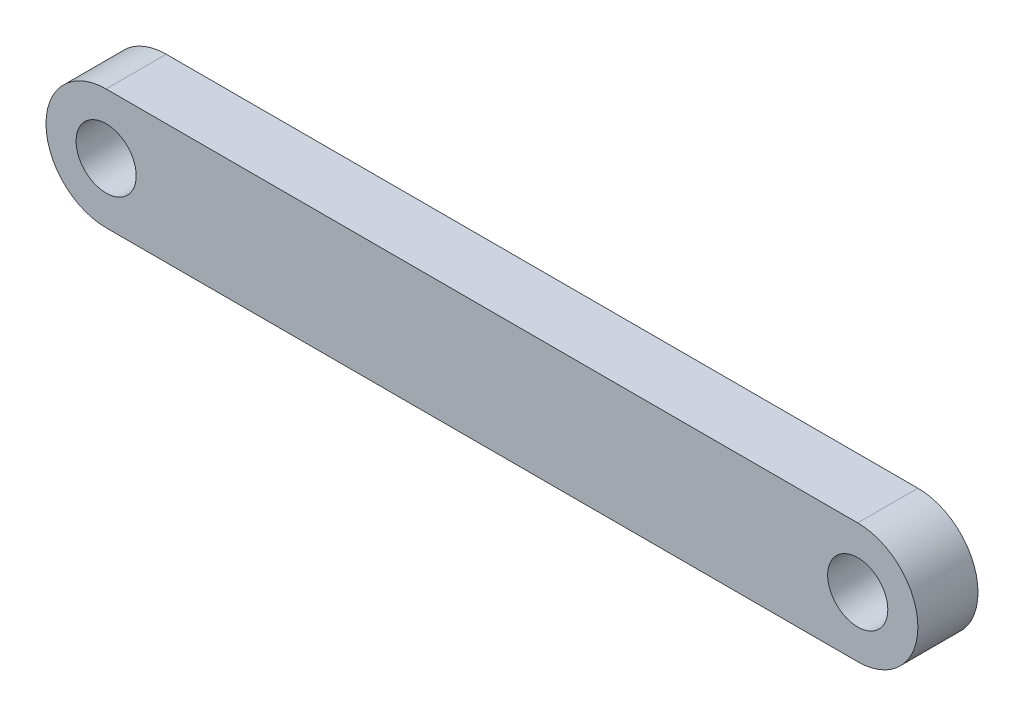
ISO-10303-21;
HEADER;
FILE_DESCRIPTION(('STEP AP214'),'2;1');
FILE_NAME('part.step','',(''),(''),'','','');
FILE_SCHEMA(('AUTOMOTIVE_DESIGN { 1 0 10303 214 1 1 1 1 }'));
ENDSEC;
DATA;
#1=APPLICATION_CONTEXT('core data for automotive mechanical design processes');
#2=APPLICATION_PROTOCOL_DEFINITION('international standard','automotive_design',2000,#1);
#3=PRODUCT_CONTEXT('',#1,'mechanical');
#4=PRODUCT('Part','Part','',(#3));
#5=PRODUCT_RELATED_PRODUCT_CATEGORY('part','',(#4));
#6=PRODUCT_DEFINITION_FORMATION('','',#4);
#7=PRODUCT_DEFINITION_CONTEXT('part definition',#1,'design');
#8=PRODUCT_DEFINITION('design','',#6,#7);
#9=PRODUCT_DEFINITION_SHAPE('','',#8);
#10=(LENGTH_UNIT() NAMED_UNIT(*) SI_UNIT(.MILLI.,.METRE.));
#11=(NAMED_UNIT(*) PLANE_ANGLE_UNIT() SI_UNIT($,.RADIAN.));
#12=(NAMED_UNIT(*) SI_UNIT($,.STERADIAN.) SOLID_ANGLE_UNIT());
#13=UNCERTAINTY_MEASURE_WITH_UNIT(LENGTH_MEASURE(1.E-05),#10,'distance_accuracy_value','');
#14=(GEOMETRIC_REPRESENTATION_CONTEXT(3) GLOBAL_UNCERTAINTY_ASSIGNED_CONTEXT((#13)) GLOBAL_UNIT_ASSIGNED_CONTEXT((#10,
#11,#12)) REPRESENTATION_CONTEXT('',''));
#15=CARTESIAN_POINT('',(0.,0.,0.));
#16=DIRECTION('',(0.,0.,1.));
#17=DIRECTION('',(1.,0.,0.));
#18=AXIS2_PLACEMENT_3D('',#15,#16,#17);
#19=CARTESIAN_POINT('',(-62.5,0.,5.));
#20=DIRECTION('',(0.,0.,1.));
#21=DIRECTION('',(1.,0.,0.));
#22=AXIS2_PLACEMENT_3D('',#19,#20,#21);
#23=PLANE('',#22);
#24=CARTESIAN_POINT('',(-62.5,0.,5.));
#25=DIRECTION('',(0.,0.,1.));
#26=DIRECTION('',(1.,0.,0.));
#27=AXIS2_PLACEMENT_3D('',#24,#25,#26);
#28=CIRCLE('',#27,5.);
#29=CARTESIAN_POINT('',(-57.5,0.,5.));
#30=VERTEX_POINT('',#29);
#31=EDGE_CURVE('E100',#30,#30,#28,.T.);
#32=ORIENTED_EDGE('',*,*,#31,.F.);
#33=EDGE_LOOP('',(#32));
#34=FACE_BOUND('',#33,.T.);
#35=CARTESIAN_POINT('',(-62.5,0.,5.));
#36=DIRECTION('',(0.,0.,1.));
#37=DIRECTION('',(1.,0.,0.));
#38=AXIS2_PLACEMENT_3D('',#35,#36,#37);
#39=CIRCLE('',#38,10.);
#40=CARTESIAN_POINT('',(-62.5,10.,5.));
#41=VERTEX_POINT('',#40);
#42=CARTESIAN_POINT('',(-62.5,-10.,5.));
#43=VERTEX_POINT('',#42);
#44=EDGE_CURVE('E85',#41,#43,#39,.T.);
#45=ORIENTED_EDGE('',*,*,#44,.T.);
#46=DIRECTION('',(1.,0.,0.));
#47=VECTOR('',#46,1.);
#48=CARTESIAN_POINT('',(-62.5,-10.,5.));
#49=LINE('',#48,#47);
#50=CARTESIAN_POINT('',(62.5,-10.,5.));
#51=VERTEX_POINT('',#50);
#52=EDGE_CURVE('E80',#43,#51,#49,.T.);
#53=ORIENTED_EDGE('',*,*,#52,.T.);
#54=CARTESIAN_POINT('',(62.5,0.,5.));
#55=DIRECTION('',(0.,0.,1.));
#56=DIRECTION('',(1.,0.,0.));
#57=AXIS2_PLACEMENT_3D('',#54,#55,#56);
#58=CIRCLE('',#57,10.);
#59=CARTESIAN_POINT('',(62.5,10.,5.));
#60=VERTEX_POINT('',#59);
#61=EDGE_CURVE('E83',#51,#60,#58,.T.);
#62=ORIENTED_EDGE('',*,*,#61,.T.);
#63=DIRECTION('',(-1.,0.,0.));
#64=VECTOR('',#63,1.);
#65=CARTESIAN_POINT('',(-62.5,10.,5.));
#66=LINE('',#65,#64);
#67=EDGE_CURVE('E50',#60,#41,#66,.T.);
#68=ORIENTED_EDGE('',*,*,#67,.T.);
#69=EDGE_LOOP('',(#45,#53,#62,#68));
#70=FACE_BOUND('',#69,.T.);
#71=CARTESIAN_POINT('',(62.5,0.,5.));
#72=DIRECTION('',(0.,0.,1.));
#73=DIRECTION('',(1.,0.,0.));
#74=AXIS2_PLACEMENT_3D('',#71,#72,#73);
#75=CIRCLE('',#74,5.);
#76=CARTESIAN_POINT('',(67.5,0.,5.));
#77=VERTEX_POINT('',#76);
#78=EDGE_CURVE('E115',#77,#77,#75,.T.);
#79=ORIENTED_EDGE('',*,*,#78,.F.);
#80=EDGE_LOOP('',(#79));
#81=FACE_BOUND('',#80,.T.);
#82=ADVANCED_FACE('F33',(#34,#70,#81),#23,.T.);
#83=CARTESIAN_POINT('',(-62.5,0.,-5.));
#84=DIRECTION('',(0.,0.,1.));
#85=DIRECTION('',(1.,0.,0.));
#86=AXIS2_PLACEMENT_3D('',#83,#84,#85);
#87=PLANE('',#86);
#88=CARTESIAN_POINT('',(-62.5,0.,-5.));
#89=DIRECTION('',(0.,0.,1.));
#90=DIRECTION('',(1.,0.,0.));
#91=AXIS2_PLACEMENT_3D('',#88,#89,#90);
#92=CIRCLE('',#91,5.);
#93=CARTESIAN_POINT('',(-57.5,0.,-5.));
#94=VERTEX_POINT('',#93);
#95=EDGE_CURVE('E112',#94,#94,#92,.T.);
#96=ORIENTED_EDGE('',*,*,#95,.T.);
#97=EDGE_LOOP('',(#96));
#98=FACE_BOUND('',#97,.T.);
#99=CARTESIAN_POINT('',(-62.5,0.,-5.));
#100=DIRECTION('',(0.,0.,1.));
#101=DIRECTION('',(1.,0.,0.));
#102=AXIS2_PLACEMENT_3D('',#99,#100,#101);
#103=CIRCLE('',#102,10.);
#104=CARTESIAN_POINT('',(-62.5,10.,-5.));
#105=VERTEX_POINT('',#104);
#106=CARTESIAN_POINT('',(-62.5,-10.,-5.));
#107=VERTEX_POINT('',#106);
#108=EDGE_CURVE('E97',#105,#107,#103,.T.);
#109=ORIENTED_EDGE('',*,*,#108,.F.);
#110=DIRECTION('',(-1.,0.,0.));
#111=VECTOR('',#110,1.);
#112=CARTESIAN_POINT('',(-62.5,10.,-5.));
#113=LINE('',#112,#111);
#114=CARTESIAN_POINT('',(62.5,10.,-5.));
#115=VERTEX_POINT('',#114);
#116=EDGE_CURVE('E73',#115,#105,#113,.T.);
#117=ORIENTED_EDGE('',*,*,#116,.F.);
#118=CARTESIAN_POINT('',(62.5,0.,-5.));
#119=DIRECTION('',(0.,0.,1.));
#120=DIRECTION('',(1.,0.,0.));
#121=AXIS2_PLACEMENT_3D('',#118,#119,#120);
#122=CIRCLE('',#121,10.);
#123=CARTESIAN_POINT('',(62.5,-10.,-5.));
#124=VERTEX_POINT('',#123);
#125=EDGE_CURVE('E67',#124,#115,#122,.T.);
#126=ORIENTED_EDGE('',*,*,#125,.F.);
#127=DIRECTION('',(1.,0.,0.));
#128=VECTOR('',#127,1.);
#129=CARTESIAN_POINT('',(-62.5,-10.,-5.));
#130=LINE('',#129,#128);
#131=EDGE_CURVE('E89',#107,#124,#130,.T.);
#132=ORIENTED_EDGE('',*,*,#131,.F.);
#133=EDGE_LOOP('',(#109,#117,#126,#132));
#134=FACE_BOUND('',#133,.T.);
#135=CARTESIAN_POINT('',(62.5,0.,-5.));
#136=DIRECTION('',(0.,0.,1.));
#137=DIRECTION('',(1.,0.,0.));
#138=AXIS2_PLACEMENT_3D('',#135,#136,#137);
#139=CIRCLE('',#138,5.);
#140=CARTESIAN_POINT('',(67.5,0.,-5.));
#141=VERTEX_POINT('',#140);
#142=EDGE_CURVE('E118',#141,#141,#139,.T.);
#143=ORIENTED_EDGE('',*,*,#142,.T.);
#144=EDGE_LOOP('',(#143));
#145=FACE_BOUND('',#144,.T.);
#146=ADVANCED_FACE('F108',(#98,#134,#145),#87,.F.);
#147=CARTESIAN_POINT('',(-62.5,0.,5.));
#148=DIRECTION('',(0.,0.,-1.));
#149=DIRECTION('',(-1.,0.,0.));
#150=AXIS2_PLACEMENT_3D('',#147,#148,#149);
#151=CYLINDRICAL_SURFACE('',#150,10.);
#152=ORIENTED_EDGE('',*,*,#108,.T.);
#153=DIRECTION('',(0.,0.,-1.));
#154=VECTOR('',#153,1.);
#155=CARTESIAN_POINT('',(-62.5,-10.,5.));
#156=LINE('',#155,#154);
#157=EDGE_CURVE('E11',#43,#107,#156,.T.);
#158=ORIENTED_EDGE('',*,*,#157,.F.);
#159=ORIENTED_EDGE('',*,*,#44,.F.);
#160=DIRECTION('',(0.,0.,-1.));
#161=VECTOR('',#160,1.);
#162=CARTESIAN_POINT('',(-62.5,10.,5.));
#163=LINE('',#162,#161);
#164=EDGE_CURVE('E93',#41,#105,#163,.T.);
#165=ORIENTED_EDGE('',*,*,#164,.T.);
#166=EDGE_LOOP('',(#152,#158,#159,#165));
#167=FACE_BOUND('',#166,.T.);
#168=ADVANCED_FACE('F35',(#167),#151,.T.);
#169=CARTESIAN_POINT('',(-62.5,-10.,5.));
#170=DIRECTION('',(0.,1.,0.));
#171=DIRECTION('',(0.,0.,1.));
#172=AXIS2_PLACEMENT_3D('',#169,#170,#171);
#173=PLANE('',#172);
#174=ORIENTED_EDGE('',*,*,#131,.T.);
#175=DIRECTION('',(0.,0.,-1.));
#176=VECTOR('',#175,1.);
#177=CARTESIAN_POINT('',(62.5,-10.,5.));
#178=LINE('',#177,#176);
#179=EDGE_CURVE('E42',#51,#124,#178,.T.);
#180=ORIENTED_EDGE('',*,*,#179,.F.);
#181=ORIENTED_EDGE('',*,*,#52,.F.);
#182=ORIENTED_EDGE('',*,*,#157,.T.);
#183=EDGE_LOOP('',(#174,#180,#181,#182));
#184=FACE_BOUND('',#183,.T.);
#185=ADVANCED_FACE('F88',(#184),#173,.F.);
#186=CARTESIAN_POINT('',(62.5,0.,5.));
#187=DIRECTION('',(0.,0.,-1.));
#188=DIRECTION('',(-1.,0.,0.));
#189=AXIS2_PLACEMENT_3D('',#186,#187,#188);
#190=CYLINDRICAL_SURFACE('',#189,10.);
#191=ORIENTED_EDGE('',*,*,#125,.T.);
#192=DIRECTION('',(0.,0.,-1.));
#193=VECTOR('',#192,1.);
#194=CARTESIAN_POINT('',(62.5,10.,5.));
#195=LINE('',#194,#193);
#196=EDGE_CURVE('E90',#60,#115,#195,.T.);
#197=ORIENTED_EDGE('',*,*,#196,.F.);
#198=ORIENTED_EDGE('',*,*,#61,.F.);
#199=ORIENTED_EDGE('',*,*,#179,.T.);
#200=EDGE_LOOP('',(#191,#197,#198,#199));
#201=FACE_BOUND('',#200,.T.);
#202=ADVANCED_FACE('F91',(#201),#190,.T.);
#203=CARTESIAN_POINT('',(-62.5,10.,5.));
#204=DIRECTION('',(0.,-1.,0.));
#205=DIRECTION('',(0.,0.,-1.));
#206=AXIS2_PLACEMENT_3D('',#203,#204,#205);
#207=PLANE('',#206);
#208=ORIENTED_EDGE('',*,*,#116,.T.);
#209=ORIENTED_EDGE('',*,*,#164,.F.);
#210=ORIENTED_EDGE('',*,*,#67,.F.);
#211=ORIENTED_EDGE('',*,*,#196,.T.);
#212=EDGE_LOOP('',(#208,#209,#210,#211));
#213=FACE_BOUND('',#212,.T.);
#214=ADVANCED_FACE('F105',(#213),#207,.F.);
#215=CARTESIAN_POINT('',(-62.5,0.,5.));
#216=DIRECTION('',(0.,0.,-1.));
#217=DIRECTION('',(-1.,0.,0.));
#218=AXIS2_PLACEMENT_3D('',#215,#216,#217);
#219=CYLINDRICAL_SURFACE('',#218,5.);
#220=ORIENTED_EDGE('',*,*,#31,.T.);
#221=EDGE_LOOP('',(#220));
#222=FACE_BOUND('',#221,.T.);
#223=ORIENTED_EDGE('',*,*,#95,.F.);
#224=EDGE_LOOP('',(#223));
#225=FACE_BOUND('',#224,.T.);
#226=ADVANCED_FACE('F136',(#222,#225),#219,.F.);
#227=CARTESIAN_POINT('',(62.5,0.,5.));
#228=DIRECTION('',(0.,0.,-1.));
#229=DIRECTION('',(-1.,0.,0.));
#230=AXIS2_PLACEMENT_3D('',#227,#228,#229);
#231=CYLINDRICAL_SURFACE('',#230,5.);
#232=ORIENTED_EDGE('',*,*,#78,.T.);
#233=EDGE_LOOP('',(#232));
#234=FACE_BOUND('',#233,.T.);
#235=ORIENTED_EDGE('',*,*,#142,.F.);
#236=EDGE_LOOP('',(#235));
#237=FACE_BOUND('',#236,.T.);
#238=ADVANCED_FACE('F124',(#234,#237),#231,.F.);
#239=CLOSED_SHELL('',(#82,#146,#168,#185,#202,#214,#226,#238));
#240=MANIFOLD_SOLID_BREP('B2',#239);
#241=ADVANCED_BREP_SHAPE_REPRESENTATION('',(#18,#240),#14);
#242=SHAPE_DEFINITION_REPRESENTATION(#9,#241);
ENDSEC;
END-ISO-10303-21;
